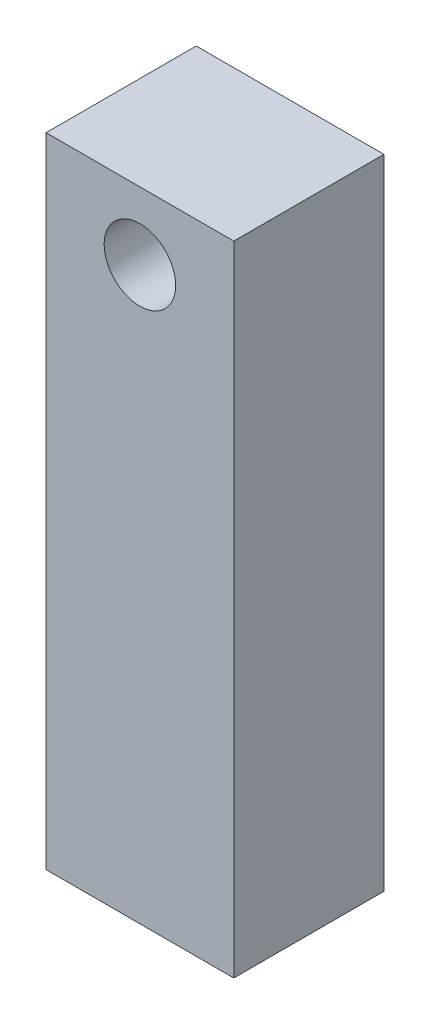
ISO-10303-21;
HEADER;
FILE_DESCRIPTION(('STEP AP214'),'2;1');
FILE_NAME('part.step','',(''),(''),'','','');
FILE_SCHEMA(('AUTOMOTIVE_DESIGN { 1 0 10303 214 1 1 1 1 }'));
ENDSEC;
DATA;
#1=APPLICATION_CONTEXT('core data for automotive mechanical design processes');
#2=APPLICATION_PROTOCOL_DEFINITION('international standard','automotive_design',2000,#1);
#3=PRODUCT_CONTEXT('',#1,'mechanical');
#4=PRODUCT('Part','Part','',(#3));
#5=PRODUCT_RELATED_PRODUCT_CATEGORY('part','',(#4));
#6=PRODUCT_DEFINITION_FORMATION('','',#4);
#7=PRODUCT_DEFINITION_CONTEXT('part definition',#1,'design');
#8=PRODUCT_DEFINITION('design','',#6,#7);
#9=PRODUCT_DEFINITION_SHAPE('','',#8);
#10=(LENGTH_UNIT() NAMED_UNIT(*) SI_UNIT(.MILLI.,.METRE.));
#11=(NAMED_UNIT(*) PLANE_ANGLE_UNIT() SI_UNIT($,.RADIAN.));
#12=(NAMED_UNIT(*) SI_UNIT($,.STERADIAN.) SOLID_ANGLE_UNIT());
#13=UNCERTAINTY_MEASURE_WITH_UNIT(LENGTH_MEASURE(1.E-05),#10,'distance_accuracy_value','');
#14=(GEOMETRIC_REPRESENTATION_CONTEXT(3) GLOBAL_UNCERTAINTY_ASSIGNED_CONTEXT((#13)) GLOBAL_UNIT_ASSIGNED_CONTEXT((#10,
#11,#12)) REPRESENTATION_CONTEXT('',''));
#15=CARTESIAN_POINT('',(0.,0.,0.));
#16=DIRECTION('',(0.,0.,1.));
#17=DIRECTION('',(1.,0.,0.));
#18=AXIS2_PLACEMENT_3D('',#15,#16,#17);
#19=CARTESIAN_POINT('',(-12.5,85.,-10.));
#20=DIRECTION('',(1.,0.,0.));
#21=DIRECTION('',(0.,0.,-1.));
#22=AXIS2_PLACEMENT_3D('',#19,#20,#21);
#23=PLANE('',#22);
#24=DIRECTION('',(0.,0.,1.));
#25=VECTOR('',#24,1.);
#26=CARTESIAN_POINT('',(-12.5,0.,-10.));
#27=LINE('',#26,#25);
#28=CARTESIAN_POINT('',(-12.5,0.,-10.));
#29=VERTEX_POINT('',#28);
#30=CARTESIAN_POINT('',(-12.5,0.,10.));
#31=VERTEX_POINT('',#30);
#32=EDGE_CURVE('E106',#29,#31,#27,.T.);
#33=ORIENTED_EDGE('',*,*,#32,.T.);
#34=DIRECTION('',(0.,-1.,0.));
#35=VECTOR('',#34,1.);
#36=CARTESIAN_POINT('',(-12.5,85.,10.));
#37=LINE('',#36,#35);
#38=CARTESIAN_POINT('',(-12.5,85.,10.));
#39=VERTEX_POINT('',#38);
#40=EDGE_CURVE('E11',#39,#31,#37,.T.);
#41=ORIENTED_EDGE('',*,*,#40,.F.);
#42=DIRECTION('',(0.,0.,1.));
#43=VECTOR('',#42,1.);
#44=CARTESIAN_POINT('',(-12.5,85.,-10.));
#45=LINE('',#44,#43);
#46=CARTESIAN_POINT('',(-12.5,85.,-10.));
#47=VERTEX_POINT('',#46);
#48=EDGE_CURVE('E91',#47,#39,#45,.T.);
#49=ORIENTED_EDGE('',*,*,#48,.F.);
#50=DIRECTION('',(0.,-1.,0.));
#51=VECTOR('',#50,1.);
#52=CARTESIAN_POINT('',(-12.5,85.,-10.));
#53=LINE('',#52,#51);
#54=EDGE_CURVE('E105',#47,#29,#53,.T.);
#55=ORIENTED_EDGE('',*,*,#54,.T.);
#56=EDGE_LOOP('',(#33,#41,#49,#55));
#57=FACE_BOUND('',#56,.T.);
#58=ADVANCED_FACE('F41',(#57),#23,.F.);
#59=CARTESIAN_POINT('',(-12.5,85.,10.));
#60=DIRECTION('',(0.,0.,-1.));
#61=DIRECTION('',(-1.,0.,0.));
#62=AXIS2_PLACEMENT_3D('',#59,#60,#61);
#63=PLANE('',#62);
#64=CARTESIAN_POINT('',(0.,76.,10.));
#65=DIRECTION('',(0.,0.,-1.));
#66=DIRECTION('',(-1.,0.,0.));
#67=AXIS2_PLACEMENT_3D('',#64,#65,#66);
#68=CIRCLE('',#67,4.7625);
#69=CARTESIAN_POINT('',(-4.7625,76.,10.));
#70=VERTEX_POINT('',#69);
#71=EDGE_CURVE('E108',#70,#70,#68,.T.);
#72=ORIENTED_EDGE('',*,*,#71,.T.);
#73=EDGE_LOOP('',(#72));
#74=FACE_BOUND('',#73,.T.);
#75=DIRECTION('',(1.,0.,0.));
#76=VECTOR('',#75,1.);
#77=CARTESIAN_POINT('',(-12.5,0.,10.));
#78=LINE('',#77,#76);
#79=CARTESIAN_POINT('',(12.5,0.,10.));
#80=VERTEX_POINT('',#79);
#81=EDGE_CURVE('E100',#31,#80,#78,.T.);
#82=ORIENTED_EDGE('',*,*,#81,.T.);
#83=DIRECTION('',(0.,-1.,0.));
#84=VECTOR('',#83,1.);
#85=CARTESIAN_POINT('',(12.5,85.,10.));
#86=LINE('',#85,#84);
#87=CARTESIAN_POINT('',(12.5,85.,10.));
#88=VERTEX_POINT('',#87);
#89=EDGE_CURVE('E49',#88,#80,#86,.T.);
#90=ORIENTED_EDGE('',*,*,#89,.F.);
#91=DIRECTION('',(1.,0.,0.));
#92=VECTOR('',#91,1.);
#93=CARTESIAN_POINT('',(-12.5,85.,10.));
#94=LINE('',#93,#92);
#95=EDGE_CURVE('E86',#39,#88,#94,.T.);
#96=ORIENTED_EDGE('',*,*,#95,.F.);
#97=ORIENTED_EDGE('',*,*,#40,.T.);
#98=EDGE_LOOP('',(#82,#90,#96,#97));
#99=FACE_BOUND('',#98,.T.);
#100=ADVANCED_FACE('F96',(#74,#99),#63,.F.);
#101=CARTESIAN_POINT('',(12.5,85.,10.));
#102=DIRECTION('',(-1.,0.,0.));
#103=DIRECTION('',(0.,0.,1.));
#104=AXIS2_PLACEMENT_3D('',#101,#102,#103);
#105=PLANE('',#104);
#106=DIRECTION('',(0.,0.,-1.));
#107=VECTOR('',#106,1.);
#108=CARTESIAN_POINT('',(12.5,0.,10.));
#109=LINE('',#108,#107);
#110=CARTESIAN_POINT('',(12.5,0.,-10.));
#111=VERTEX_POINT('',#110);
#112=EDGE_CURVE('E73',#80,#111,#109,.T.);
#113=ORIENTED_EDGE('',*,*,#112,.T.);
#114=DIRECTION('',(0.,-1.,0.));
#115=VECTOR('',#114,1.);
#116=CARTESIAN_POINT('',(12.5,85.,-10.));
#117=LINE('',#116,#115);
#118=CARTESIAN_POINT('',(12.5,85.,-10.));
#119=VERTEX_POINT('',#118);
#120=EDGE_CURVE('E98',#119,#111,#117,.T.);
#121=ORIENTED_EDGE('',*,*,#120,.F.);
#122=DIRECTION('',(0.,0.,-1.));
#123=VECTOR('',#122,1.);
#124=CARTESIAN_POINT('',(12.5,85.,10.));
#125=LINE('',#124,#123);
#126=EDGE_CURVE('E93',#88,#119,#125,.T.);
#127=ORIENTED_EDGE('',*,*,#126,.F.);
#128=ORIENTED_EDGE('',*,*,#89,.T.);
#129=EDGE_LOOP('',(#113,#121,#127,#128));
#130=FACE_BOUND('',#129,.T.);
#131=ADVANCED_FACE('F99',(#130),#105,.F.);
#132=CARTESIAN_POINT('',(12.5,85.,-10.));
#133=DIRECTION('',(0.,0.,1.));
#134=DIRECTION('',(1.,0.,0.));
#135=AXIS2_PLACEMENT_3D('',#132,#133,#134);
#136=PLANE('',#135);
#137=CARTESIAN_POINT('',(0.,76.,-10.));
#138=DIRECTION('',(0.,0.,1.));
#139=DIRECTION('',(1.,0.,0.));
#140=AXIS2_PLACEMENT_3D('',#137,#138,#139);
#141=CIRCLE('',#140,4.7625);
#142=CARTESIAN_POINT('',(4.7625,76.,-10.));
#143=VERTEX_POINT('',#142);
#144=EDGE_CURVE('E42',#143,#143,#141,.T.);
#145=ORIENTED_EDGE('',*,*,#144,.T.);
#146=EDGE_LOOP('',(#145));
#147=FACE_BOUND('',#146,.T.);
#148=DIRECTION('',(-1.,0.,0.));
#149=VECTOR('',#148,1.);
#150=CARTESIAN_POINT('',(12.5,0.,-10.));
#151=LINE('',#150,#149);
#152=EDGE_CURVE('E81',#111,#29,#151,.T.);
#153=ORIENTED_EDGE('',*,*,#152,.T.);
#154=ORIENTED_EDGE('',*,*,#54,.F.);
#155=DIRECTION('',(-1.,0.,0.));
#156=VECTOR('',#155,1.);
#157=CARTESIAN_POINT('',(12.5,85.,-10.));
#158=LINE('',#157,#156);
#159=EDGE_CURVE('E59',#119,#47,#158,.T.);
#160=ORIENTED_EDGE('',*,*,#159,.F.);
#161=ORIENTED_EDGE('',*,*,#120,.T.);
#162=EDGE_LOOP('',(#153,#154,#160,#161));
#163=FACE_BOUND('',#162,.T.);
#164=ADVANCED_FACE('F111',(#147,#163),#136,.F.);
#165=CARTESIAN_POINT('',(0.,85.,0.));
#166=DIRECTION('',(0.,1.,0.));
#167=DIRECTION('',(0.,0.,1.));
#168=AXIS2_PLACEMENT_3D('',#165,#166,#167);
#169=PLANE('',#168);
#170=ORIENTED_EDGE('',*,*,#48,.T.);
#171=ORIENTED_EDGE('',*,*,#95,.T.);
#172=ORIENTED_EDGE('',*,*,#126,.T.);
#173=ORIENTED_EDGE('',*,*,#159,.T.);
#174=EDGE_LOOP('',(#170,#171,#172,#173));
#175=FACE_BOUND('',#174,.T.);
#176=ADVANCED_FACE('F90',(#175),#169,.T.);
#177=CARTESIAN_POINT('',(0.,0.,0.));
#178=DIRECTION('',(0.,1.,0.));
#179=DIRECTION('',(0.,0.,1.));
#180=AXIS2_PLACEMENT_3D('',#177,#178,#179);
#181=PLANE('',#180);
#182=ORIENTED_EDGE('',*,*,#32,.F.);
#183=ORIENTED_EDGE('',*,*,#152,.F.);
#184=ORIENTED_EDGE('',*,*,#112,.F.);
#185=ORIENTED_EDGE('',*,*,#81,.F.);
#186=EDGE_LOOP('',(#182,#183,#184,#185));
#187=FACE_BOUND('',#186,.T.);
#188=ADVANCED_FACE('F116',(#187),#181,.F.);
#189=CARTESIAN_POINT('',(0.,76.,-12.));
#190=DIRECTION('',(0.,0.,1.));
#191=DIRECTION('',(1.,0.,0.));
#192=AXIS2_PLACEMENT_3D('',#189,#190,#191);
#193=CYLINDRICAL_SURFACE('',#192,4.7625);
#194=ORIENTED_EDGE('',*,*,#144,.F.);
#195=EDGE_LOOP('',(#194));
#196=FACE_BOUND('',#195,.T.);
#197=ORIENTED_EDGE('',*,*,#71,.F.);
#198=EDGE_LOOP('',(#197));
#199=FACE_BOUND('',#198,.T.);
#200=ADVANCED_FACE('F130',(#196,#199),#193,.F.);
#201=CLOSED_SHELL('',(#58,#100,#131,#164,#176,#188,#200));
#202=MANIFOLD_SOLID_BREP('B2',#201);
#203=ADVANCED_BREP_SHAPE_REPRESENTATION('',(#18,#202),#14);
#204=SHAPE_DEFINITION_REPRESENTATION(#9,#203);
ENDSEC;
END-ISO-10303-21;
